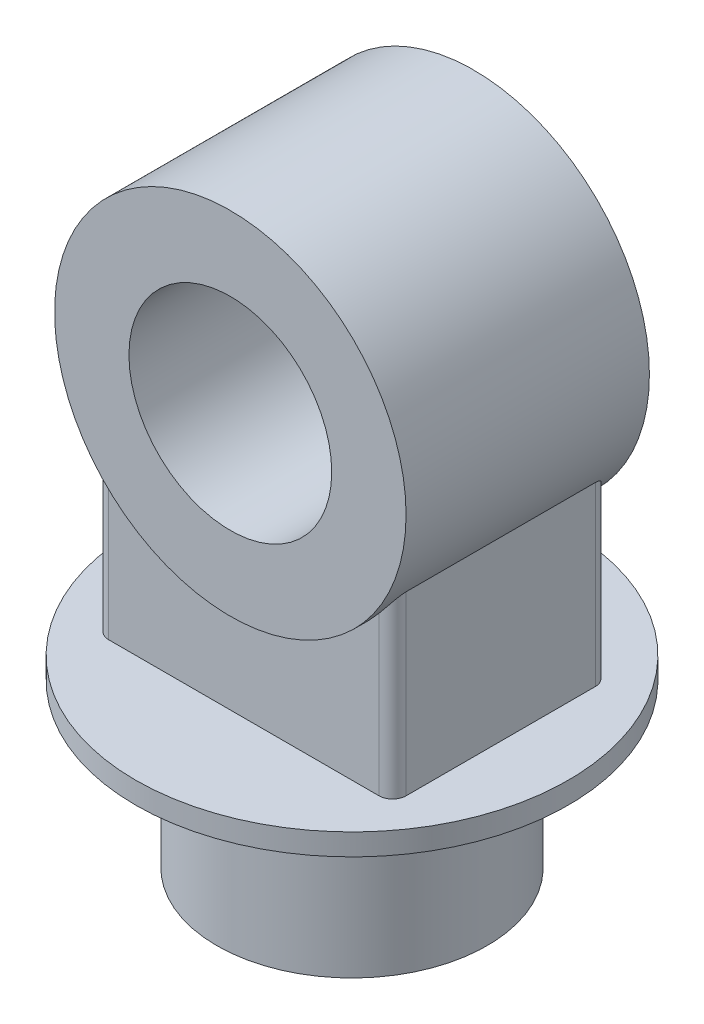
ISO-10303-21;
HEADER;
FILE_DESCRIPTION(('STEP AP214'),'2;1');
FILE_NAME('part.step','',(''),(''),'','','');
FILE_SCHEMA(('AUTOMOTIVE_DESIGN { 1 0 10303 214 1 1 1 1 }'));
ENDSEC;
DATA;
#1=APPLICATION_CONTEXT('core data for automotive mechanical design processes');
#2=APPLICATION_PROTOCOL_DEFINITION('international standard','automotive_design',2000,#1);
#3=PRODUCT_CONTEXT('',#1,'mechanical');
#4=PRODUCT('Part','Part','',(#3));
#5=PRODUCT_RELATED_PRODUCT_CATEGORY('part','',(#4));
#6=PRODUCT_DEFINITION_FORMATION('','',#4);
#7=PRODUCT_DEFINITION_CONTEXT('part definition',#1,'design');
#8=PRODUCT_DEFINITION('design','',#6,#7);
#9=PRODUCT_DEFINITION_SHAPE('','',#8);
#10=(LENGTH_UNIT() NAMED_UNIT(*) SI_UNIT(.MILLI.,.METRE.));
#11=(NAMED_UNIT(*) PLANE_ANGLE_UNIT() SI_UNIT($,.RADIAN.));
#12=(NAMED_UNIT(*) SI_UNIT($,.STERADIAN.) SOLID_ANGLE_UNIT());
#13=UNCERTAINTY_MEASURE_WITH_UNIT(LENGTH_MEASURE(1.E-05),#10,'distance_accuracy_value','');
#14=(GEOMETRIC_REPRESENTATION_CONTEXT(3) GLOBAL_UNCERTAINTY_ASSIGNED_CONTEXT((#13)) GLOBAL_UNIT_ASSIGNED_CONTEXT((#10,
#11,#12)) REPRESENTATION_CONTEXT('',''));
#15=CARTESIAN_POINT('',(0.,0.,0.));
#16=DIRECTION('',(0.,0.,1.));
#17=DIRECTION('',(1.,0.,0.));
#18=AXIS2_PLACEMENT_3D('',#15,#16,#17);
#19=CARTESIAN_POINT('',(0.,3048.,0.));
#20=DIRECTION('',(0.,-1.,0.));
#21=DIRECTION('',(0.,0.,-1.));
#22=AXIS2_PLACEMENT_3D('',#19,#20,#21);
#23=CYLINDRICAL_SURFACE('',#22,2540.);
#24=CARTESIAN_POINT('',(0.,3048.,0.));
#25=DIRECTION('',(0.,1.,0.));
#26=DIRECTION('',(0.,0.,1.));
#27=AXIS2_PLACEMENT_3D('',#24,#25,#26);
#28=CIRCLE('',#27,2540.);
#29=CARTESIAN_POINT('',(0.,3048.,2540.));
#30=VERTEX_POINT('',#29);
#31=EDGE_CURVE('E149',#30,#30,#28,.T.);
#32=ORIENTED_EDGE('',*,*,#31,.F.);
#33=EDGE_LOOP('',(#32));
#34=FACE_BOUND('',#33,.T.);
#35=CARTESIAN_POINT('',(0.,0.,0.));
#36=DIRECTION('',(0.,1.,0.));
#37=DIRECTION('',(0.,0.,1.));
#38=AXIS2_PLACEMENT_3D('',#35,#36,#37);
#39=CIRCLE('',#38,2540.);
#40=CARTESIAN_POINT('',(0.,0.,2540.));
#41=VERTEX_POINT('',#40);
#42=EDGE_CURVE('E233',#41,#41,#39,.T.);
#43=ORIENTED_EDGE('',*,*,#42,.T.);
#44=EDGE_LOOP('',(#43));
#45=FACE_BOUND('',#44,.T.);
#46=ADVANCED_FACE('F42',(#34,#45),#23,.T.);
#47=CARTESIAN_POINT('',(0.,0.,0.));
#48=DIRECTION('',(0.,1.,0.));
#49=DIRECTION('',(0.,0.,1.));
#50=AXIS2_PLACEMENT_3D('',#47,#48,#49);
#51=PLANE('',#50);
#52=ORIENTED_EDGE('',*,*,#42,.F.);
#53=EDGE_LOOP('',(#52));
#54=FACE_BOUND('',#53,.T.);
#55=ADVANCED_FACE('F245',(#54),#51,.F.);
#56=CARTESIAN_POINT('',(0.,3454.4,0.));
#57=DIRECTION('',(0.,-1.,0.));
#58=DIRECTION('',(0.,0.,-1.));
#59=AXIS2_PLACEMENT_3D('',#56,#57,#58);
#60=CYLINDRICAL_SURFACE('',#59,4064.);
#61=CARTESIAN_POINT('',(0.,3454.4,0.));
#62=DIRECTION('',(0.,1.,0.));
#63=DIRECTION('',(0.,0.,1.));
#64=AXIS2_PLACEMENT_3D('',#61,#62,#63);
#65=CIRCLE('',#64,4064.);
#66=CARTESIAN_POINT('',(0.,3454.4,4064.));
#67=VERTEX_POINT('',#66);
#68=EDGE_CURVE('E229',#67,#67,#65,.T.);
#69=ORIENTED_EDGE('',*,*,#68,.F.);
#70=EDGE_LOOP('',(#69));
#71=FACE_BOUND('',#70,.T.);
#72=CARTESIAN_POINT('',(0.,3048.,0.));
#73=DIRECTION('',(0.,1.,0.));
#74=DIRECTION('',(0.,0.,1.));
#75=AXIS2_PLACEMENT_3D('',#72,#73,#74);
#76=CIRCLE('',#75,4064.);
#77=CARTESIAN_POINT('',(0.,3048.,4064.));
#78=VERTEX_POINT('',#77);
#79=EDGE_CURVE('E234',#78,#78,#76,.T.);
#80=ORIENTED_EDGE('',*,*,#79,.T.);
#81=EDGE_LOOP('',(#80));
#82=FACE_BOUND('',#81,.T.);
#83=ADVANCED_FACE('F247',(#71,#82),#60,.T.);
#84=CARTESIAN_POINT('',(0.,3454.4,0.));
#85=DIRECTION('',(0.,1.,0.));
#86=DIRECTION('',(0.,0.,1.));
#87=AXIS2_PLACEMENT_3D('',#84,#85,#86);
#88=PLANE('',#87);
#89=DIRECTION('',(0.,0.,1.));
#90=VECTOR('',#89,1.);
#91=CARTESIAN_POINT('',(-2794.,3454.4,-2032.));
#92=LINE('',#91,#90);
#93=CARTESIAN_POINT('',(-2794.,3454.4,-1778.));
#94=VERTEX_POINT('',#93);
#95=CARTESIAN_POINT('',(-2794.,3454.4,1778.));
#96=VERTEX_POINT('',#95);
#97=EDGE_CURVE('E209',#94,#96,#92,.T.);
#98=ORIENTED_EDGE('',*,*,#97,.F.);
#99=CARTESIAN_POINT('',(-2540.,3454.4,-1778.));
#100=DIRECTION('',(0.,1.,0.));
#101=DIRECTION('',(0.,0.,1.));
#102=AXIS2_PLACEMENT_3D('',#99,#100,#101);
#103=CIRCLE('',#102,254.);
#104=CARTESIAN_POINT('',(-2540.,3454.4,-2032.));
#105=VERTEX_POINT('',#104);
#106=EDGE_CURVE('E127',#94,#105,#103,.F.);
#107=ORIENTED_EDGE('',*,*,#106,.T.);
#108=DIRECTION('',(-1.,0.,0.));
#109=VECTOR('',#108,1.);
#110=CARTESIAN_POINT('',(2794.,3454.4,-2032.));
#111=LINE('',#110,#109);
#112=CARTESIAN_POINT('',(2540.,3454.4,-2032.));
#113=VERTEX_POINT('',#112);
#114=EDGE_CURVE('E138',#113,#105,#111,.T.);
#115=ORIENTED_EDGE('',*,*,#114,.F.);
#116=CARTESIAN_POINT('',(2540.,3454.4,-1778.));
#117=DIRECTION('',(0.,1.,0.));
#118=DIRECTION('',(0.,0.,1.));
#119=AXIS2_PLACEMENT_3D('',#116,#117,#118);
#120=CIRCLE('',#119,254.);
#121=CARTESIAN_POINT('',(2794.,3454.4,-1778.));
#122=VERTEX_POINT('',#121);
#123=EDGE_CURVE('E126',#113,#122,#120,.F.);
#124=ORIENTED_EDGE('',*,*,#123,.T.);
#125=DIRECTION('',(0.,0.,-1.));
#126=VECTOR('',#125,1.);
#127=CARTESIAN_POINT('',(2794.,3454.4,-2032.));
#128=LINE('',#127,#126);
#129=CARTESIAN_POINT('',(2794.,3454.4,1778.));
#130=VERTEX_POINT('',#129);
#131=EDGE_CURVE('E281',#130,#122,#128,.T.);
#132=ORIENTED_EDGE('',*,*,#131,.F.);
#133=CARTESIAN_POINT('',(2540.,3454.4,1778.));
#134=DIRECTION('',(0.,1.,0.));
#135=DIRECTION('',(0.,0.,1.));
#136=AXIS2_PLACEMENT_3D('',#133,#134,#135);
#137=CIRCLE('',#136,254.);
#138=CARTESIAN_POINT('',(2540.,3454.4,2032.));
#139=VERTEX_POINT('',#138);
#140=EDGE_CURVE('E64',#130,#139,#137,.F.);
#141=ORIENTED_EDGE('',*,*,#140,.T.);
#142=DIRECTION('',(1.,0.,0.));
#143=VECTOR('',#142,1.);
#144=CARTESIAN_POINT('',(2794.,3454.4,2032.));
#145=LINE('',#144,#143);
#146=CARTESIAN_POINT('',(-2540.,3454.4,2032.));
#147=VERTEX_POINT('',#146);
#148=EDGE_CURVE('E210',#147,#139,#145,.T.);
#149=ORIENTED_EDGE('',*,*,#148,.F.);
#150=CARTESIAN_POINT('',(-2540.,3454.4,1778.));
#151=DIRECTION('',(0.,1.,0.));
#152=DIRECTION('',(0.,0.,1.));
#153=AXIS2_PLACEMENT_3D('',#150,#151,#152);
#154=CIRCLE('',#153,254.);
#155=EDGE_CURVE('E57',#147,#96,#154,.F.);
#156=ORIENTED_EDGE('',*,*,#155,.T.);
#157=EDGE_LOOP('',(#98,#107,#115,#124,#132,#141,#149,#156));
#158=FACE_BOUND('',#157,.T.);
#159=ORIENTED_EDGE('',*,*,#68,.T.);
#160=EDGE_LOOP('',(#159));
#161=FACE_BOUND('',#160,.T.);
#162=ADVANCED_FACE('F207',(#158,#161),#88,.T.);
#163=CARTESIAN_POINT('',(0.,3048.,0.));
#164=DIRECTION('',(0.,1.,0.));
#165=DIRECTION('',(0.,0.,1.));
#166=AXIS2_PLACEMENT_3D('',#163,#164,#165);
#167=PLANE('',#166);
#168=ORIENTED_EDGE('',*,*,#31,.T.);
#169=EDGE_LOOP('',(#168));
#170=FACE_BOUND('',#169,.T.);
#171=ORIENTED_EDGE('',*,*,#79,.F.);
#172=EDGE_LOOP('',(#171));
#173=FACE_BOUND('',#172,.T.);
#174=ADVANCED_FACE('F256',(#170,#173),#167,.F.);
#175=CARTESIAN_POINT('',(2794.,11836.402,2032.));
#176=DIRECTION('',(0.,0.,-1.));
#177=DIRECTION('',(-1.,0.,0.));
#178=AXIS2_PLACEMENT_3D('',#175,#176,#177);
#179=PLANE('',#178);
#180=ORIENTED_EDGE('',*,*,#148,.T.);
#181=DIRECTION('',(0.,-1.,0.));
#182=VECTOR('',#181,1.);
#183=CARTESIAN_POINT('',(2540.,11836.402,2032.));
#184=LINE('',#183,#182);
#185=CARTESIAN_POINT('',(2540.,6424.51753881881,2032.));
#186=VERTEX_POINT('',#185);
#187=EDGE_CURVE('E165',#139,#186,#184,.F.);
#188=ORIENTED_EDGE('',*,*,#187,.T.);
#189=CARTESIAN_POINT('',(0.,8534.4,2032.));
#190=DIRECTION('',(0.,0.,-1.));
#191=DIRECTION('',(-1.,0.,0.));
#192=AXIS2_PLACEMENT_3D('',#189,#190,#191);
#193=CIRCLE('',#192,3302.);
#194=CARTESIAN_POINT('',(-2540.,6424.51753881881,2032.));
#195=VERTEX_POINT('',#194);
#196=EDGE_CURVE('E137',#195,#186,#193,.F.);
#197=ORIENTED_EDGE('',*,*,#196,.F.);
#198=DIRECTION('',(0.,-1.,0.));
#199=VECTOR('',#198,1.);
#200=CARTESIAN_POINT('',(-2540.,11836.402,2032.));
#201=LINE('',#200,#199);
#202=EDGE_CURVE('E162',#195,#147,#201,.T.);
#203=ORIENTED_EDGE('',*,*,#202,.T.);
#204=EDGE_LOOP('',(#180,#188,#197,#203));
#205=FACE_BOUND('',#204,.T.);
#206=ADVANCED_FACE('F218',(#205),#179,.F.);
#207=CARTESIAN_POINT('',(-2794.,11836.402,-2032.));
#208=DIRECTION('',(1.,0.,0.));
#209=DIRECTION('',(0.,0.,-1.));
#210=AXIS2_PLACEMENT_3D('',#207,#208,#209);
#211=PLANE('',#210);
#212=DIRECTION('',(0.,0.,-1.));
#213=VECTOR('',#212,1.);
#214=CARTESIAN_POINT('',(-2794.,6774.63637951002,2286.));
#215=LINE('',#214,#213);
#216=CARTESIAN_POINT('',(-2794.,6774.63637951002,-1778.));
#217=VERTEX_POINT('',#216);
#218=CARTESIAN_POINT('',(-2794.,6774.63637951002,1778.));
#219=VERTEX_POINT('',#218);
#220=EDGE_CURVE('E118',#217,#219,#215,.F.);
#221=ORIENTED_EDGE('',*,*,#220,.F.);
#222=DIRECTION('',(0.,-1.,0.));
#223=VECTOR('',#222,1.);
#224=CARTESIAN_POINT('',(-2794.,11836.402,-1778.));
#225=LINE('',#224,#223);
#226=EDGE_CURVE('E133',#217,#94,#225,.T.);
#227=ORIENTED_EDGE('',*,*,#226,.T.);
#228=ORIENTED_EDGE('',*,*,#97,.T.);
#229=DIRECTION('',(0.,-1.,0.));
#230=VECTOR('',#229,1.);
#231=CARTESIAN_POINT('',(-2794.,11836.402,1778.));
#232=LINE('',#231,#230);
#233=EDGE_CURVE('E135',#96,#219,#232,.F.);
#234=ORIENTED_EDGE('',*,*,#233,.T.);
#235=EDGE_LOOP('',(#221,#227,#228,#234));
#236=FACE_BOUND('',#235,.T.);
#237=ADVANCED_FACE('F131',(#236),#211,.F.);
#238=CARTESIAN_POINT('',(2794.,11836.402,-2032.));
#239=DIRECTION('',(-1.,0.,0.));
#240=DIRECTION('',(0.,0.,1.));
#241=AXIS2_PLACEMENT_3D('',#238,#239,#240);
#242=PLANE('',#241);
#243=ORIENTED_EDGE('',*,*,#131,.T.);
#244=DIRECTION('',(0.,-1.,0.));
#245=VECTOR('',#244,1.);
#246=CARTESIAN_POINT('',(2794.,11836.402,-1778.));
#247=LINE('',#246,#245);
#248=CARTESIAN_POINT('',(2794.,6774.63637951002,-1778.));
#249=VERTEX_POINT('',#248);
#250=EDGE_CURVE('E159',#122,#249,#247,.F.);
#251=ORIENTED_EDGE('',*,*,#250,.T.);
#252=DIRECTION('',(0.,0.,-1.));
#253=VECTOR('',#252,1.);
#254=CARTESIAN_POINT('',(2794.,6774.63637951002,2286.));
#255=LINE('',#254,#253);
#256=CARTESIAN_POINT('',(2794.,6774.63637951002,1778.));
#257=VERTEX_POINT('',#256);
#258=EDGE_CURVE('E221',#257,#249,#255,.T.);
#259=ORIENTED_EDGE('',*,*,#258,.F.);
#260=DIRECTION('',(0.,-1.,0.));
#261=VECTOR('',#260,1.);
#262=CARTESIAN_POINT('',(2794.,11836.402,1778.));
#263=LINE('',#262,#261);
#264=EDGE_CURVE('E155',#257,#130,#263,.T.);
#265=ORIENTED_EDGE('',*,*,#264,.T.);
#266=EDGE_LOOP('',(#243,#251,#259,#265));
#267=FACE_BOUND('',#266,.T.);
#268=ADVANCED_FACE('F264',(#267),#242,.F.);
#269=CARTESIAN_POINT('',(2794.,11836.402,-2032.));
#270=DIRECTION('',(0.,0.,1.));
#271=DIRECTION('',(1.,0.,0.));
#272=AXIS2_PLACEMENT_3D('',#269,#270,#271);
#273=PLANE('',#272);
#274=ORIENTED_EDGE('',*,*,#114,.T.);
#275=DIRECTION('',(0.,-1.,0.));
#276=VECTOR('',#275,1.);
#277=CARTESIAN_POINT('',(-2540.,11836.402,-2032.));
#278=LINE('',#277,#276);
#279=CARTESIAN_POINT('',(-2540.,6424.51753881881,-2032.));
#280=VERTEX_POINT('',#279);
#281=EDGE_CURVE('E147',#105,#280,#278,.F.);
#282=ORIENTED_EDGE('',*,*,#281,.T.);
#283=CARTESIAN_POINT('',(0.,8534.4,-2032.));
#284=DIRECTION('',(0.,0.,1.));
#285=DIRECTION('',(1.,0.,0.));
#286=AXIS2_PLACEMENT_3D('',#283,#284,#285);
#287=CIRCLE('',#286,3302.);
#288=CARTESIAN_POINT('',(2540.,6424.51753881881,-2032.));
#289=VERTEX_POINT('',#288);
#290=EDGE_CURVE('E121',#289,#280,#287,.F.);
#291=ORIENTED_EDGE('',*,*,#290,.F.);
#292=DIRECTION('',(0.,-1.,0.));
#293=VECTOR('',#292,1.);
#294=CARTESIAN_POINT('',(2540.,11836.402,-2032.));
#295=LINE('',#294,#293);
#296=EDGE_CURVE('E142',#289,#113,#295,.T.);
#297=ORIENTED_EDGE('',*,*,#296,.T.);
#298=EDGE_LOOP('',(#274,#282,#291,#297));
#299=FACE_BOUND('',#298,.T.);
#300=ADVANCED_FACE('F268',(#299),#273,.F.);
#301=CARTESIAN_POINT('',(0.,8534.4,2286.));
#302=DIRECTION('',(0.,0.,-1.));
#303=DIRECTION('',(-1.,0.,0.));
#304=AXIS2_PLACEMENT_3D('',#301,#302,#303);
#305=CYLINDRICAL_SURFACE('',#304,3302.);
#306=CARTESIAN_POINT('',(0.,8534.4,2286.));
#307=DIRECTION('',(0.,0.,1.));
#308=DIRECTION('',(1.,0.,0.));
#309=AXIS2_PLACEMENT_3D('',#306,#307,#308);
#310=CIRCLE('',#309,3302.);
#311=CARTESIAN_POINT('',(3302.,8534.4,2286.));
#312=VERTEX_POINT('',#311);
#313=EDGE_CURVE('E212',#312,#312,#310,.T.);
#314=ORIENTED_EDGE('',*,*,#313,.F.);
#315=EDGE_LOOP('',(#314));
#316=FACE_BOUND('',#315,.T.);
#317=CARTESIAN_POINT('',(0.,8534.4,-2286.));
#318=DIRECTION('',(0.,0.,1.));
#319=DIRECTION('',(1.,0.,0.));
#320=AXIS2_PLACEMENT_3D('',#317,#318,#319);
#321=CIRCLE('',#320,3302.);
#322=CARTESIAN_POINT('',(3302.,8534.4,-2286.));
#323=VERTEX_POINT('',#322);
#324=EDGE_CURVE('E286',#323,#323,#321,.T.);
#325=ORIENTED_EDGE('',*,*,#324,.T.);
#326=EDGE_LOOP('',(#325));
#327=FACE_BOUND('',#326,.T.);
#328=ORIENTED_EDGE('',*,*,#290,.T.);
#329=CARTESIAN_POINT('',(-2540.,6424.51753881881,-2032.));
#330=CARTESIAN_POINT('',(-2542.83977860557,6427.93622161435,-2031.9999734893));
#331=CARTESIAN_POINT('',(-2545.67262886829,6431.36062344505,-2031.95237538715));
#332=CARTESIAN_POINT('',(-2551.32318321051,6438.2192475725,-2031.76323632053));
#333=CARTESIAN_POINT('',(-2554.14088748035,6441.65346974501,-2031.62169653936));
#334=CARTESIAN_POINT('',(-2559.75979933091,6448.53004086149,-2031.2458832437));
#335=CARTESIAN_POINT('',(-2562.56100768401,6451.97238941422,-2031.01161410658));
#336=CARTESIAN_POINT('',(-2568.14589800616,6458.86384836957,-2030.45135161428));
#337=CARTESIAN_POINT('',(-2570.92957990912,6462.31295879762,-2030.12535791346));
#338=CARTESIAN_POINT('',(-2576.48087919177,6469.21963800538,-2029.38216934964));
#339=CARTESIAN_POINT('',(-2579.24847905792,6472.67721168396,-2028.96488924465));
#340=CARTESIAN_POINT('',(-2584.76388850416,6479.59606452742,-2028.04002300334));
#341=CARTESIAN_POINT('',(-2587.51169806634,6483.05734369566,-2027.53243678526));
#342=CARTESIAN_POINT('',(-2592.98649763878,6489.98211102143,-2026.42751407468));
#343=CARTESIAN_POINT('',(-2595.71348738783,6493.44559920609,-2025.8301764581));
#344=CARTESIAN_POINT('',(-2601.14557385789,6500.37318641411,-2024.5461577295));
#345=CARTESIAN_POINT('',(-2603.85067055837,6503.83728543803,-2023.85947653378));
#346=CARTESIAN_POINT('',(-2609.26591476256,6510.80047435419,-2022.38941490154));
#347=CARTESIAN_POINT('',(-2611.97582296525,6514.29955401973,-2021.60510427863));
#348=CARTESIAN_POINT('',(-2617.37117316369,6521.29502174544,-2019.94558797426));
#349=CARTESIAN_POINT('',(-2620.05661516282,6524.79140980597,-2019.07038230541));
#350=CARTESIAN_POINT('',(-2625.40202527443,6531.77982659366,-2017.22893926882));
#351=CARTESIAN_POINT('',(-2628.06199278137,6535.27185521549,-2016.2626997431));
#352=CARTESIAN_POINT('',(-2633.35530016709,6542.24964417058,-2014.23889753478));
#353=CARTESIAN_POINT('',(-2635.98863999184,6545.73540449111,-2013.18133466691));
#354=CARTESIAN_POINT('',(-2641.22624406055,6552.69697178173,-2010.97493145605));
#355=CARTESIAN_POINT('',(-2643.83052222256,6556.17278286649,-2009.82613715092));
#356=CARTESIAN_POINT('',(-2649.01014681255,6563.11412661108,-2007.43609803065));
#357=CARTESIAN_POINT('',(-2651.58549346622,6566.57965935092,-2006.19485393725));
#358=CARTESIAN_POINT('',(-2656.70581227357,6573.49797664728,-2003.61907238506));
#359=CARTESIAN_POINT('',(-2659.25078710741,6576.95076230981,-2002.28454323056));
#360=CARTESIAN_POINT('',(-2664.30926376633,6583.84151191211,-1999.52090942607));
#361=CARTESIAN_POINT('',(-2666.82276550256,6587.27947581002,-1998.09180450918));
#362=CARTESIAN_POINT('',(-2672.42939284743,6594.97919920992,-1994.7752522514));
#363=CARTESIAN_POINT('',(-2675.51347601726,6599.23619069841,-1992.86135887939));
#364=CARTESIAN_POINT('',(-2681.62749276398,6607.71753574206,-1988.88138436238));
#365=CARTESIAN_POINT('',(-2684.65742844154,6611.94189055976,-1986.81530913733));
#366=CARTESIAN_POINT('',(-2690.66001770349,6620.35210095167,-1982.52668728021));
#367=CARTESIAN_POINT('',(-2693.63266895241,6624.5379549526,-1980.30413428573));
#368=CARTESIAN_POINT('',(-2699.51669088708,6632.86387869651,-1975.6977137502));
#369=CARTESIAN_POINT('',(-2702.42806123731,6637.00394818874,-1973.31384532623));
#370=CARTESIAN_POINT('',(-2708.17703457426,6645.21863977067,-1968.38587042588));
#371=CARTESIAN_POINT('',(-2711.01481966652,6649.29341146342,-1965.84222642692));
#372=CARTESIAN_POINT('',(-2716.61983468486,6657.37978858898,-1960.58205341184));
#373=CARTESIAN_POINT('',(-2719.38706292178,6661.39139250864,-1957.8655202621));
#374=CARTESIAN_POINT('',(-2724.84380189956,6669.33874584763,-1952.25293041896));
#375=CARTESIAN_POINT('',(-2727.53333823711,6673.27452010443,-1949.35693386455));
#376=CARTESIAN_POINT('',(-2732.82817451339,6681.05806853299,-1943.37607553343));
#377=CARTESIAN_POINT('',(-2735.43348225661,6684.90585084821,-1940.29123133213));
#378=CARTESIAN_POINT('',(-2739.59611244767,6691.08087918665,-1935.11125140864));
#379=CARTESIAN_POINT('',(-2741.18172278654,6693.43974099827,-1933.07634598778));
#380=CARTESIAN_POINT('',(-2744.31380948043,6698.11199902808,-1928.92589797701));
#381=CARTESIAN_POINT('',(-2745.86028747485,6700.42539715001,-1926.81035877451));
#382=CARTESIAN_POINT('',(-2748.9113713213,6705.00178293512,-1922.49574593458));
#383=CARTESIAN_POINT('',(-2750.41597436698,6707.26476721766,-1920.29666672176));
#384=CARTESIAN_POINT('',(-2753.37994525516,6711.73435120665,-1915.81227371327));
#385=CARTESIAN_POINT('',(-2754.83931292045,6713.9409506922,-1913.52695957984));
#386=CARTESIAN_POINT('',(-2757.70866421257,6718.29050192588,-1908.86794930323));
#387=CARTESIAN_POINT('',(-2759.11866259583,6720.43347266295,-1906.49428001457));
#388=CARTESIAN_POINT('',(-2761.8855537627,6724.64903794148,-1901.65504311363));
#389=CARTESIAN_POINT('',(-2763.24244554673,6726.72163115819,-1899.18947377327));
#390=CARTESIAN_POINT('',(-2765.89799144176,6730.78746003102,-1894.16441362361));
#391=CARTESIAN_POINT('',(-2767.19666069295,6732.78071630262,-1891.60494754971));
#392=CARTESIAN_POINT('',(-2769.73059696136,6736.67871305885,-1886.38937943326));
#393=CARTESIAN_POINT('',(-2770.96586878652,6738.58346025479,-1883.73328474504));
#394=CARTESIAN_POINT('',(-2773.87166230378,6743.07371981701,-1877.1852796379));
#395=CARTESIAN_POINT('',(-2775.50702168491,6745.60905649436,-1873.24296962534));
#396=CARTESIAN_POINT('',(-2778.61817497287,6750.44559855716,-1865.15576363629));
#397=CARTESIAN_POINT('',(-2780.09397924302,6752.74681914817,-1861.01088084258));
#398=CARTESIAN_POINT('',(-2782.16790082376,6755.98851413022,-1854.65281448186));
#399=CARTESIAN_POINT('',(-2782.83479269946,6757.03229884736,-1852.5141337591));
#400=CARTESIAN_POINT('',(-2784.12022732024,6759.04651802023,-1848.18834886601));
#401=CARTESIAN_POINT('',(-2784.738775148,6760.01696018649,-1846.00124981728));
#402=CARTESIAN_POINT('',(-2785.92442375123,6761.87910476923,-1841.57999978288));
#403=CARTESIAN_POINT('',(-2786.49152353764,6762.77080567192,-1839.34584789365));
#404=CARTESIAN_POINT('',(-2787.57105773969,6764.46988520958,-1834.83268561231));
#405=CARTESIAN_POINT('',(-2788.08349366066,6765.27726616652,-1832.55367645752));
#406=CARTESIAN_POINT('',(-2789.00083023081,6766.7238347182,-1828.18997813993));
#407=CARTESIAN_POINT('',(-2789.41136999526,6767.37178014488,-1826.10937609511));
#408=CARTESIAN_POINT('',(-2790.18361669496,6768.59142989419,-1821.91697488124));
#409=CARTESIAN_POINT('',(-2790.5453245395,6769.16313563644,-1819.80517629389));
#410=CARTESIAN_POINT('',(-2791.21767452149,6770.22645718312,-1815.55408765039));
#411=CARTESIAN_POINT('',(-2791.52833122583,6770.71809583344,-1813.41480562482));
#412=CARTESIAN_POINT('',(-2792.09673285078,6771.61807423499,-1809.11184192219));
#413=CARTESIAN_POINT('',(-2792.35447894374,6772.02641583182,-1806.94816078685));
#414=CARTESIAN_POINT('',(-2792.81823440346,6772.76141589791,-1802.5731474505));
#415=CARTESIAN_POINT('',(-2793.02355301945,6773.08698357203,-1800.36155811253));
#416=CARTESIAN_POINT('',(-2793.37669027031,6773.64709970057,-1795.92235426052));
#417=CARTESIAN_POINT('',(-2793.52450975042,6773.88164949295,-1793.69473998253));
#418=CARTESIAN_POINT('',(-2793.7617057171,6774.2580791307,-1789.22543095468));
#419=CARTESIAN_POINT('',(-2793.8510029289,6774.399833274,-1786.98372124131));
#420=CARTESIAN_POINT('',(-2793.94036625205,6774.54170102292,-1783.61708634609));
#421=CARTESIAN_POINT('',(-2793.96272361549,6774.57719636991,-1782.49410431326));
#422=CARTESIAN_POINT('',(-2793.99254184018,6774.62453802274,-1780.24743081372));
#423=CARTESIAN_POINT('',(-2794.00000252148,6774.63638404291,-1779.12373933859));
#424=CARTESIAN_POINT('',(-2794.,6774.63637951002,-1778.));
#425=B_SPLINE_CURVE_WITH_KNOTS('',3,(#329,#330,#331,#332,#333,#334,#335,#336,#337,#338,#339,
#340,#341,#342,#343,#344,#345,#346,#347,#348,#349,#350,#351,#352,#353,#354,#355,#356,#357,#358,
#359,#360,#361,#362,#363,#364,#365,#366,#367,#368,#369,#370,#371,#372,#373,#374,#375,#376,#377,
#378,#379,#380,#381,#382,#383,#384,#385,#386,#387,#388,#389,#390,#391,#392,#393,#394,#395,#396,
#397,#398,#399,#400,#401,#402,#403,#404,#405,#406,#407,#408,#409,#410,#411,#412,#413,#414,#415,
#416,#417,#418,#419,#420,#421,#422,#423,#424),.UNSPECIFIED.,.F.,.F.,(4,2,2,2,2,2,2,2,2,2,2,2,2,
2,2,2,2,2,2,2,2,2,2,2,2,2,2,2,2,2,2,2,2,2,2,2,2,2,2,2,2,2,2,2,2,2,2,4),(0.,13.3325731309089,
26.6649783266545,39.9967542281352,53.328580368407,66.6729091320811,80.0172499763164,
93.3617579654759,106.706278456229,120.189385373508,133.672490420767,147.155915169039,
160.639367271433,174.116057973203,187.592643475093,201.068030805628,214.543456166552,
231.324022303993,248.103936015557,264.884532396287,281.665220628519,298.399394733672,
315.133969088228,331.86296562332,348.590407606825,359.075960416877,369.561073217003,
380.046887018741,390.532741893908,401.015435329469,411.498325979355,421.978474656348,
432.457827360742,447.339644037475,462.220493540057,469.633233914451,477.045193896404,
484.45729634197,491.869194622672,498.519717435844,505.17011639461,511.818614428611,
518.466965137211,525.198850780705,531.93063746234,538.671524335319,542.042519234386,
545.41355485247),.UNSPECIFIED.);
#426=EDGE_CURVE('E115',#280,#217,#425,.T.);
#427=ORIENTED_EDGE('',*,*,#426,.T.);
#428=ORIENTED_EDGE('',*,*,#220,.T.);
#429=CARTESIAN_POINT('',(-2794.,6774.63637951002,1778.));
#430=CARTESIAN_POINT('',(-2794.00000174196,6774.63638264187,1779.02497469673));
#431=CARTESIAN_POINT('',(-2793.99379531502,6774.62652820204,1780.04991307944));
#432=CARTESIAN_POINT('',(-2793.96898653863,6774.58713976709,1782.09925365362));
#433=CARTESIAN_POINT('',(-2793.95038428594,6774.55760592558,1783.12365584922));
#434=CARTESIAN_POINT('',(-2793.87602052908,6774.43954839144,1786.19512814832));
#435=CARTESIAN_POINT('',(-2793.80170201586,6774.32156867143,1788.24072314059));
#436=CARTESIAN_POINT('',(-2793.60415589371,6774.00803960556,1792.3213484798));
#437=CARTESIAN_POINT('',(-2793.4809793328,6773.81257122178,1794.35638761458));
#438=CARTESIAN_POINT('',(-2793.1864877954,6773.3453953325,1798.41422230554));
#439=CARTESIAN_POINT('',(-2793.01517225589,6773.07368693534,1800.43701771824));
#440=CARTESIAN_POINT('',(-2792.62751614018,6772.4591137757,1804.44520941196));
#441=CARTESIAN_POINT('',(-2792.41167301453,6772.11703527968,1806.43077473624));
#442=CARTESIAN_POINT('',(-2791.93509518367,6771.36210378945,1810.38318260995));
#443=CARTESIAN_POINT('',(-2791.67435540532,6770.94924279711,1812.350023017));
#444=CARTESIAN_POINT('',(-2791.10935827596,6770.05512731515,1816.26221601373));
#445=CARTESIAN_POINT('',(-2790.8050915588,6769.57385810557,1818.20756388133));
#446=CARTESIAN_POINT('',(-2790.15464273529,6768.54569130306,1822.0737781585));
#447=CARTESIAN_POINT('',(-2789.80845896916,6767.99879111139,1823.99464359532));
#448=CARTESIAN_POINT('',(-2788.98756133025,6766.70288100536,1828.26931069734));
#449=CARTESIAN_POINT('',(-2788.50197668463,6765.93692440399,1830.61590628665));
#450=CARTESIAN_POINT('',(-2787.47213896295,6764.31412699742,1835.26437678415));
#451=CARTESIAN_POINT('',(-2786.92788265238,6763.4572811816,1837.56624921853));
#452=CARTESIAN_POINT('',(-2785.78403886702,6761.65850041581,1842.12272519984));
#453=CARTESIAN_POINT('',(-2785.18444647286,6760.71655790092,1844.3773245223));
#454=CARTESIAN_POINT('',(-2783.93331193687,6758.75344997865,1848.83717328533));
#455=CARTESIAN_POINT('',(-2783.2817639944,6757.73227572571,1851.04241718028));
#456=CARTESIAN_POINT('',(-2781.24880267458,6754.55016280933,1857.5990409809));
#457=CARTESIAN_POINT('',(-2779.79346674321,6752.27755379692,1861.87397358444));
#458=CARTESIAN_POINT('',(-2776.71164258883,6747.47958151699,1870.21373405539));
#459=CARTESIAN_POINT('',(-2775.08514410281,6744.95420309372,1874.27854930221));
#460=CARTESIAN_POINT('',(-2772.07222516912,6740.29146751183,1881.29341047258));
#461=CARTESIAN_POINT('',(-2770.71606582389,6738.19760124299,1884.28565876981));
#462=CARTESIAN_POINT('',(-2767.92330444798,6733.8969721097,1890.14952163145));
#463=CARTESIAN_POINT('',(-2766.48669269039,6731.6901955969,1893.02112153537));
#464=CARTESIAN_POINT('',(-2763.54020191773,6727.17648854903,1898.647701459));
#465=CARTESIAN_POINT('',(-2762.03029069471,6724.8695140345,1901.40262919879));
#466=CARTESIAN_POINT('',(-2758.94448224591,6720.16813772115,1906.79818291332));
#467=CARTESIAN_POINT('',(-2757.36858703324,6717.77373858987,1909.43881237023));
#468=CARTESIAN_POINT('',(-2754.15426526213,6712.90423917882,1914.61347351019));
#469=CARTESIAN_POINT('',(-2752.51575266154,6710.42902859016,1917.14734766375));
#470=CARTESIAN_POINT('',(-2749.1833665016,6705.41014460104,1922.10846056806));
#471=CARTESIAN_POINT('',(-2747.48949315198,6702.86647145994,1924.53569972269));
#472=CARTESIAN_POINT('',(-2744.05100156406,6697.71884086233,1929.28710197205));
#473=CARTESIAN_POINT('',(-2742.30639038596,6695.11489180344,1931.61127929533));
#474=CARTESIAN_POINT('',(-2738.769899571,6689.8530404074,1936.16076825609));
#475=CARTESIAN_POINT('',(-2736.97801727887,6687.19513504139,1938.38607432095));
#476=CARTESIAN_POINT('',(-2733.61263609546,6682.21922383177,1942.42634774005));
#477=CARTESIAN_POINT('',(-2732.04501310431,6679.90762504794,1944.25413060125));
#478=CARTESIAN_POINT('',(-2728.87955782605,6675.25280835313,1947.84179508296));
#479=CARTESIAN_POINT('',(-2727.28172650891,6672.90959145808,1949.60167887818));
#480=CARTESIAN_POINT('',(-2724.05722829755,6668.19412265563,1953.05576103033));
#481=CARTESIAN_POINT('',(-2722.43055729003,6665.82186662168,1954.74994990584));
#482=CARTESIAN_POINT('',(-2719.1500634985,6661.05131054242,1958.0741729757));
#483=CARTESIAN_POINT('',(-2717.49624048546,6658.6530102775,1959.70420662853));
#484=CARTESIAN_POINT('',(-2714.16186413331,6653.83147654578,1962.90263653937));
#485=CARTESIAN_POINT('',(-2712.48129652358,6651.40823002927,1964.47099822743));
#486=CARTESIAN_POINT('',(-2709.09553255246,6646.54031619722,1967.54664742016));
#487=CARTESIAN_POINT('',(-2707.39033625005,6644.09564893299,1969.05393507109));
#488=CARTESIAN_POINT('',(-2703.95649437307,6639.18701803243,1972.00875831289));
#489=CARTESIAN_POINT('',(-2702.22785016726,6636.72305552597,1973.45629737179));
#490=CARTESIAN_POINT('',(-2698.74799473771,6631.77749275273,1976.2929972149));
#491=CARTESIAN_POINT('',(-2696.99678299418,6629.29589208028,1977.6821566513));
#492=CARTESIAN_POINT('',(-2691.70215025175,6621.81512290854,1981.770414619));
#493=CARTESIAN_POINT('',(-2688.12594121955,6616.7917264225,1984.38324681021));
#494=CARTESIAN_POINT('',(-2680.89314443601,6606.69293438015,1989.38698684325));
#495=CARTESIAN_POINT('',(-2677.23655621501,6601.61753852012,1991.77789338794));
#496=CARTESIAN_POINT('',(-2669.84918636412,6591.4257532344,1996.34385578948));
#497=CARTESIAN_POINT('',(-2666.11842077062,6586.30937280895,1998.51895770487));
#498=CARTESIAN_POINT('',(-2658.58678822939,6576.04333620551,2002.65894009359));
#499=CARTESIAN_POINT('',(-2654.78592053195,6570.89367967201,2004.62381831713));
#500=CARTESIAN_POINT('',(-2646.58812802052,6559.85477332083,2008.6046567198));
#501=CARTESIAN_POINT('',(-2642.18146656641,6553.96173358412,2010.59010030168));
#502=CARTESIAN_POINT('',(-2633.28867851362,6542.1526825357,2014.2973300933));
#503=CARTESIAN_POINT('',(-2628.80255037975,6536.23667078192,2016.01911120325));
#504=CARTESIAN_POINT('',(-2619.75573130556,6524.39018378718,2019.20119896269));
#505=CARTESIAN_POINT('',(-2615.19503127795,6518.45970685955,2020.66147348204));
#506=CARTESIAN_POINT('',(-2606.00482472903,6506.59350783939,2023.32069900341));
#507=CARTESIAN_POINT('',(-2601.37531840472,6500.65778576193,2024.51965075352));
#508=CARTESIAN_POINT('',(-2592.09799330875,6488.84681357841,2026.64477616783));
#509=CARTESIAN_POINT('',(-2587.45078945451,6482.97153624512,2027.57348688204));
#510=CARTESIAN_POINT('',(-2578.09904246893,6471.23116463606,2029.17118483997));
#511=CARTESIAN_POINT('',(-2573.39450013142,6465.36607022058,2029.84017567529));
#512=CARTESIAN_POINT('',(-2566.29956178754,6456.58270137503,2030.64598852297));
#513=CARTESIAN_POINT('',(-2563.92846688015,6453.65758194597,2030.88163357237));
#514=CARTESIAN_POINT('',(-2559.17399740084,6447.81268062286,2031.28649815157));
#515=CARTESIAN_POINT('',(-2556.7906228582,6444.8928987161,2031.45571783975));
#516=CARTESIAN_POINT('',(-2552.01225802699,6439.05953843777,2031.72708357714));
#517=CARTESIAN_POINT('',(-2549.61726727032,6436.14596032312,2031.82922690043));
#518=CARTESIAN_POINT('',(-2544.81651489251,6430.32606114424,2031.96567848209));
#519=CARTESIAN_POINT('',(-2542.41075318327,6427.41974013967,2031.99998618455));
#520=CARTESIAN_POINT('',(-2540.,6424.51753881881,2032.));
#521=B_SPLINE_CURVE_WITH_KNOTS('',3,(#429,#430,#431,#432,#433,#434,#435,#436,#437,#438,#439,
#440,#441,#442,#443,#444,#445,#446,#447,#448,#449,#450,#451,#452,#453,#454,#455,#456,#457,#458,
#459,#460,#461,#462,#463,#464,#465,#466,#467,#468,#469,#470,#471,#472,#473,#474,#475,#476,#477,
#478,#479,#480,#481,#482,#483,#484,#485,#486,#487,#488,#489,#490,#491,#492,#493,#494,#495,#496,
#497,#498,#499,#500,#501,#502,#503,#504,#505,#506,#507,#508,#509,#510,#511,#512,#513,#514,#515,
#516,#517,#518,#519,#520),.UNSPECIFIED.,.F.,.F.,(4,2,2,2,2,2,2,2,2,2,2,2,2,2,2,2,2,2,2,2,2,2,2,
2,2,2,2,2,2,2,2,2,2,2,2,2,2,2,2,2,2,2,2,2,2,4),(0.,3.07478563664829,6.14954727233706,
12.2982937397526,18.4406327054803,24.5830435118247,30.6602265948873,36.738096827451,
42.8172768713665,48.8966977085488,56.4409866155735,63.9856916462394,71.5310680453812,
79.0772880374413,94.227089045328,109.377798962321,121.06068448359,132.744985558408,
144.434468050095,156.123594163572,167.829404477559,179.535170451804,191.239315282869,
202.944118954383,212.956900554085,222.969361192932,232.983261543179,242.997246399629,
253.016766776402,263.036263156721,273.055177148301,283.074322319114,303.160473090191,
323.246741255267,343.328713203348,363.410900044784,386.270421599316,409.130385250049,
431.993155677034,454.855860653754,477.496438924224,500.136704093643,511.454576500168,
522.772421919116,534.090727254507,545.409125343038),.UNSPECIFIED.);
#522=EDGE_CURVE('E11',#219,#195,#521,.T.);
#523=ORIENTED_EDGE('',*,*,#522,.T.);
#524=ORIENTED_EDGE('',*,*,#196,.T.);
#525=CARTESIAN_POINT('',(2540.,6424.51753881881,2032.));
#526=CARTESIAN_POINT('',(2542.83977860557,6427.93622161435,2031.9999734893));
#527=CARTESIAN_POINT('',(2545.67262886829,6431.36062344504,2031.95237538715));
#528=CARTESIAN_POINT('',(2551.32318321051,6438.2192475725,2031.76323632053));
#529=CARTESIAN_POINT('',(2554.14088748035,6441.65346974501,2031.62169653936));
#530=CARTESIAN_POINT('',(2559.75979933091,6448.53004086149,2031.2458832437));
#531=CARTESIAN_POINT('',(2562.56100768401,6451.97238941422,2031.01161410658));
#532=CARTESIAN_POINT('',(2568.14589800616,6458.86384836956,2030.45135161428));
#533=CARTESIAN_POINT('',(2570.92957990912,6462.31295879762,2030.12535791346));
#534=CARTESIAN_POINT('',(2576.48087919177,6469.21963800538,2029.38216934964));
#535=CARTESIAN_POINT('',(2579.24847905792,6472.67721168395,2028.96488924465));
#536=CARTESIAN_POINT('',(2584.76388850416,6479.59606452742,2028.04002300334));
#537=CARTESIAN_POINT('',(2587.51169806634,6483.05734369566,2027.53243678525));
#538=CARTESIAN_POINT('',(2592.98649763878,6489.98211102143,2026.42751407468));
#539=CARTESIAN_POINT('',(2595.71348738783,6493.44559920609,2025.8301764581));
#540=CARTESIAN_POINT('',(2601.14557385789,6500.37318641411,2024.5461577295));
#541=CARTESIAN_POINT('',(2603.85067055837,6503.83728543803,2023.85947653378));
#542=CARTESIAN_POINT('',(2609.26591476256,6510.80047435418,2022.38941490154));
#543=CARTESIAN_POINT('',(2611.97582296525,6514.29955401973,2021.60510427863));
#544=CARTESIAN_POINT('',(2617.37117316369,6521.29502174544,2019.94558797426));
#545=CARTESIAN_POINT('',(2620.05661516282,6524.79140980596,2019.07038230541));
#546=CARTESIAN_POINT('',(2625.40202527443,6531.77982659366,2017.22893926882));
#547=CARTESIAN_POINT('',(2628.06199278137,6535.27185521549,2016.2626997431));
#548=CARTESIAN_POINT('',(2633.35530016709,6542.24964417058,2014.23889753478));
#549=CARTESIAN_POINT('',(2635.98863999184,6545.73540449111,2013.18133466691));
#550=CARTESIAN_POINT('',(2641.22624406055,6552.69697178173,2010.97493145605));
#551=CARTESIAN_POINT('',(2643.83052222256,6556.17278286649,2009.82613715091));
#552=CARTESIAN_POINT('',(2649.01014681255,6563.11412661108,2007.43609803064));
#553=CARTESIAN_POINT('',(2651.58549346622,6566.57965935092,2006.19485393725));
#554=CARTESIAN_POINT('',(2656.70581227357,6573.49797664728,2003.61907238506));
#555=CARTESIAN_POINT('',(2659.25078710741,6576.95076230981,2002.28454323056));
#556=CARTESIAN_POINT('',(2664.30926376633,6583.84151191211,1999.52090942607));
#557=CARTESIAN_POINT('',(2666.82276550256,6587.27947581002,1998.09180450918));
#558=CARTESIAN_POINT('',(2672.42939284742,6594.97919920992,1994.7752522514));
#559=CARTESIAN_POINT('',(2675.51347601726,6599.2361906984,1992.86135887939));
#560=CARTESIAN_POINT('',(2681.62749276398,6607.71753574206,1988.88138436238));
#561=CARTESIAN_POINT('',(2684.65742844154,6611.94189055976,1986.81530913733));
#562=CARTESIAN_POINT('',(2690.66001770349,6620.35210095167,1982.5266872802));
#563=CARTESIAN_POINT('',(2693.63266895241,6624.5379549526,1980.30413428572));
#564=CARTESIAN_POINT('',(2699.51669088708,6632.8638786965,1975.69771375019));
#565=CARTESIAN_POINT('',(2702.42806123731,6637.00394818874,1973.31384532623));
#566=CARTESIAN_POINT('',(2708.17703457426,6645.21863977067,1968.38587042588));
#567=CARTESIAN_POINT('',(2711.01481966652,6649.29341146342,1965.84222642692));
#568=CARTESIAN_POINT('',(2716.61983468486,6657.37978858898,1960.58205341184));
#569=CARTESIAN_POINT('',(2719.38706292178,6661.39139250864,1957.8655202621));
#570=CARTESIAN_POINT('',(2724.84380189956,6669.33874584763,1952.25293041896));
#571=CARTESIAN_POINT('',(2727.53333823711,6673.27452010443,1949.35693386455));
#572=CARTESIAN_POINT('',(2732.82817451339,6681.05806853299,1943.37607553343));
#573=CARTESIAN_POINT('',(2735.43348225661,6684.90585084821,1940.29123133213));
#574=CARTESIAN_POINT('',(2739.59611244767,6691.08087918665,1935.11125140864));
#575=CARTESIAN_POINT('',(2741.18172278654,6693.43974099826,1933.07634598778));
#576=CARTESIAN_POINT('',(2744.31380948043,6698.11199902808,1928.92589797701));
#577=CARTESIAN_POINT('',(2745.86028747485,6700.42539715001,1926.81035877451));
#578=CARTESIAN_POINT('',(2748.9113713213,6705.00178293511,1922.49574593458));
#579=CARTESIAN_POINT('',(2750.41597436698,6707.26476721766,1920.29666672176));
#580=CARTESIAN_POINT('',(2753.37994525516,6711.73435120665,1915.81227371327));
#581=CARTESIAN_POINT('',(2754.83931292045,6713.9409506922,1913.52695957984));
#582=CARTESIAN_POINT('',(2757.70866421257,6718.29050192588,1908.86794930323));
#583=CARTESIAN_POINT('',(2759.11866259583,6720.43347266294,1906.49428001457));
#584=CARTESIAN_POINT('',(2761.8855537627,6724.64903794148,1901.65504311363));
#585=CARTESIAN_POINT('',(2763.24244554673,6726.72163115819,1899.18947377327));
#586=CARTESIAN_POINT('',(2765.89799144176,6730.78746003102,1894.16441362361));
#587=CARTESIAN_POINT('',(2767.19666069295,6732.78071630262,1891.60494754971));
#588=CARTESIAN_POINT('',(2769.73059696136,6736.67871305885,1886.38937943326));
#589=CARTESIAN_POINT('',(2770.96586878652,6738.58346025479,1883.73328474504));
#590=CARTESIAN_POINT('',(2773.87166230378,6743.07371981701,1877.1852796379));
#591=CARTESIAN_POINT('',(2775.50702168491,6745.60905649436,1873.24296962534));
#592=CARTESIAN_POINT('',(2778.61817497287,6750.44559855716,1865.15576363629));
#593=CARTESIAN_POINT('',(2780.09397924301,6752.74681914817,1861.01088084258));
#594=CARTESIAN_POINT('',(2782.16790082376,6755.98851413021,1854.65281448186));
#595=CARTESIAN_POINT('',(2782.83479269946,6757.03229884736,1852.5141337591));
#596=CARTESIAN_POINT('',(2784.12022732024,6759.04651802023,1848.18834886601));
#597=CARTESIAN_POINT('',(2784.738775148,6760.01696018649,1846.00124981728));
#598=CARTESIAN_POINT('',(2785.92442375123,6761.87910476923,1841.57999978288));
#599=CARTESIAN_POINT('',(2786.49152353763,6762.77080567192,1839.34584789365));
#600=CARTESIAN_POINT('',(2787.57105773969,6764.46988520958,1834.83268561231));
#601=CARTESIAN_POINT('',(2788.08349366066,6765.27726616652,1832.55367645752));
#602=CARTESIAN_POINT('',(2789.00083023081,6766.72383471819,1828.18997813993));
#603=CARTESIAN_POINT('',(2789.41136999525,6767.37178014488,1826.10937609511));
#604=CARTESIAN_POINT('',(2790.18361669496,6768.59142989418,1821.91697488124));
#605=CARTESIAN_POINT('',(2790.5453245395,6769.16313563644,1819.80517629389));
#606=CARTESIAN_POINT('',(2791.21767452149,6770.22645718312,1815.55408765039));
#607=CARTESIAN_POINT('',(2791.52833122583,6770.71809583344,1813.41480562482));
#608=CARTESIAN_POINT('',(2792.09673285078,6771.61807423499,1809.11184192219));
#609=CARTESIAN_POINT('',(2792.35447894374,6772.02641583182,1806.94816078685));
#610=CARTESIAN_POINT('',(2792.81823440346,6772.76141589791,1802.5731474505));
#611=CARTESIAN_POINT('',(2793.02355301945,6773.08698357203,1800.36155811253));
#612=CARTESIAN_POINT('',(2793.37669027031,6773.64709970057,1795.92235426052));
#613=CARTESIAN_POINT('',(2793.52450975042,6773.88164949294,1793.69473998253));
#614=CARTESIAN_POINT('',(2793.7617057171,6774.2580791307,1789.22543095468));
#615=CARTESIAN_POINT('',(2793.8510029289,6774.39983327399,1786.98372124131));
#616=CARTESIAN_POINT('',(2793.94036625205,6774.54170102292,1783.61708634609));
#617=CARTESIAN_POINT('',(2793.96272361549,6774.57719636991,1782.49410431326));
#618=CARTESIAN_POINT('',(2793.99254184017,6774.62453802273,1780.24743081372));
#619=CARTESIAN_POINT('',(2794.00000252148,6774.63638404291,1779.12373933859));
#620=CARTESIAN_POINT('',(2794.,6774.63637951002,1778.));
#621=B_SPLINE_CURVE_WITH_KNOTS('',3,(#525,#526,#527,#528,#529,#530,#531,#532,#533,#534,#535,
#536,#537,#538,#539,#540,#541,#542,#543,#544,#545,#546,#547,#548,#549,#550,#551,#552,#553,#554,
#555,#556,#557,#558,#559,#560,#561,#562,#563,#564,#565,#566,#567,#568,#569,#570,#571,#572,#573,
#574,#575,#576,#577,#578,#579,#580,#581,#582,#583,#584,#585,#586,#587,#588,#589,#590,#591,#592,
#593,#594,#595,#596,#597,#598,#599,#600,#601,#602,#603,#604,#605,#606,#607,#608,#609,#610,#611,
#612,#613,#614,#615,#616,#617,#618,#619,#620),.UNSPECIFIED.,.F.,.F.,(4,2,2,2,2,2,2,2,2,2,2,2,2,
2,2,2,2,2,2,2,2,2,2,2,2,2,2,2,2,2,2,2,2,2,2,2,2,2,2,2,2,2,2,2,2,2,2,4),(0.,13.3325731309089,
26.6649783266542,39.9967542281354,53.3285803684073,66.6729091320811,80.0172499763158,
93.3617579654749,106.706278456228,120.189385373507,133.672490420768,147.155915169039,
160.639367271434,174.116057973203,187.592643475094,201.068030805628,214.543456166552,
231.324022303992,248.103936015558,264.884532396287,281.665220628519,298.399394733673,
315.133969088229,331.86296562332,348.590407606825,359.075960416876,369.561073217003,
380.04688701874,390.532741893907,401.015435329467,411.498325979353,421.978474656347,
432.45782736074,447.339644037474,462.220493540056,469.63323391445,477.045193896402,
484.457296341969,491.869194622671,498.519717435843,505.170116394608,511.818614428609,
518.46696513721,525.198850780704,531.930637462339,538.671524335317,542.042519234385,
545.413554852469),.UNSPECIFIED.);
#622=EDGE_CURVE('E200',#186,#257,#621,.T.);
#623=ORIENTED_EDGE('',*,*,#622,.T.);
#624=ORIENTED_EDGE('',*,*,#258,.T.);
#625=CARTESIAN_POINT('',(2794.,6774.63637951002,-1778.));
#626=CARTESIAN_POINT('',(2794.00000174196,6774.63638264187,-1779.02497469673));
#627=CARTESIAN_POINT('',(2793.99379531501,6774.62652820204,-1780.04991307944));
#628=CARTESIAN_POINT('',(2793.96898653863,6774.58713976708,-1782.09925365362));
#629=CARTESIAN_POINT('',(2793.95038428594,6774.55760592557,-1783.12365584922));
#630=CARTESIAN_POINT('',(2793.87602052908,6774.43954839144,-1786.19512814832));
#631=CARTESIAN_POINT('',(2793.80170201586,6774.32156867142,-1788.24072314059));
#632=CARTESIAN_POINT('',(2793.60415589371,6774.00803960555,-1792.3213484798));
#633=CARTESIAN_POINT('',(2793.4809793328,6773.81257122177,-1794.35638761458));
#634=CARTESIAN_POINT('',(2793.18648779539,6773.3453953325,-1798.41422230554));
#635=CARTESIAN_POINT('',(2793.01517225588,6773.07368693533,-1800.43701771824));
#636=CARTESIAN_POINT('',(2792.62751614018,6772.4591137757,-1804.44520941196));
#637=CARTESIAN_POINT('',(2792.41167301453,6772.11703527968,-1806.43077473624));
#638=CARTESIAN_POINT('',(2791.93509518367,6771.36210378945,-1810.38318260995));
#639=CARTESIAN_POINT('',(2791.67435540532,6770.94924279711,-1812.350023017));
#640=CARTESIAN_POINT('',(2791.10935827596,6770.05512731515,-1816.26221601373));
#641=CARTESIAN_POINT('',(2790.8050915588,6769.57385810556,-1818.20756388133));
#642=CARTESIAN_POINT('',(2790.15464273528,6768.54569130306,-1822.0737781585));
#643=CARTESIAN_POINT('',(2789.80845896915,6767.99879111139,-1823.99464359532));
#644=CARTESIAN_POINT('',(2788.98756133025,6766.70288100536,-1828.26931069734));
#645=CARTESIAN_POINT('',(2788.50197668463,6765.93692440399,-1830.61590628665));
#646=CARTESIAN_POINT('',(2787.47213896295,6764.31412699741,-1835.26437678415));
#647=CARTESIAN_POINT('',(2786.92788265238,6763.4572811816,-1837.56624921853));
#648=CARTESIAN_POINT('',(2785.78403886701,6761.6585004158,-1842.12272519984));
#649=CARTESIAN_POINT('',(2785.18444647286,6760.71655790091,-1844.3773245223));
#650=CARTESIAN_POINT('',(2783.93331193687,6758.75344997865,-1848.83717328533));
#651=CARTESIAN_POINT('',(2783.2817639944,6757.73227572571,-1851.04241718028));
#652=CARTESIAN_POINT('',(2781.24880267457,6754.55016280933,-1857.5990409809));
#653=CARTESIAN_POINT('',(2779.79346674321,6752.27755379691,-1861.87397358445));
#654=CARTESIAN_POINT('',(2776.71164258883,6747.47958151698,-1870.21373405539));
#655=CARTESIAN_POINT('',(2775.08514410281,6744.95420309372,-1874.27854930221));
#656=CARTESIAN_POINT('',(2772.07222516912,6740.29146751182,-1881.29341047258));
#657=CARTESIAN_POINT('',(2770.71606582389,6738.19760124299,-1884.28565876981));
#658=CARTESIAN_POINT('',(2767.92330444797,6733.89697210969,-1890.14952163145));
#659=CARTESIAN_POINT('',(2766.48669269038,6731.69019559689,-1893.02112153538));
#660=CARTESIAN_POINT('',(2763.54020191772,6727.17648854902,-1898.64770145901));
#661=CARTESIAN_POINT('',(2762.03029069471,6724.8695140345,-1901.40262919879));
#662=CARTESIAN_POINT('',(2758.9444822459,6720.16813772115,-1906.79818291332));
#663=CARTESIAN_POINT('',(2757.36858703324,6717.77373858987,-1909.43881237023));
#664=CARTESIAN_POINT('',(2754.15426526213,6712.90423917881,-1914.61347351019));
#665=CARTESIAN_POINT('',(2752.51575266153,6710.42902859016,-1917.14734766375));
#666=CARTESIAN_POINT('',(2749.1833665016,6705.41014460104,-1922.10846056806));
#667=CARTESIAN_POINT('',(2747.48949315198,6702.86647145994,-1924.53569972269));
#668=CARTESIAN_POINT('',(2744.05100156406,6697.71884086233,-1929.28710197205));
#669=CARTESIAN_POINT('',(2742.30639038596,6695.11489180344,-1931.61127929533));
#670=CARTESIAN_POINT('',(2738.76989957099,6689.85304040739,-1936.1607682561));
#671=CARTESIAN_POINT('',(2736.97801727886,6687.19513504139,-1938.38607432095));
#672=CARTESIAN_POINT('',(2733.61263609546,6682.21922383176,-1942.42634774005));
#673=CARTESIAN_POINT('',(2732.04501310431,6679.90762504793,-1944.25413060125));
#674=CARTESIAN_POINT('',(2728.87955782605,6675.25280835312,-1947.84179508296));
#675=CARTESIAN_POINT('',(2727.28172650891,6672.90959145807,-1949.60167887818));
#676=CARTESIAN_POINT('',(2724.05722829755,6668.19412265562,-1953.05576103033));
#677=CARTESIAN_POINT('',(2722.43055729003,6665.82186662168,-1954.74994990584));
#678=CARTESIAN_POINT('',(2719.15006349849,6661.05131054242,-1958.0741729757));
#679=CARTESIAN_POINT('',(2717.49624048545,6658.6530102775,-1959.70420662853));
#680=CARTESIAN_POINT('',(2714.1618641333,6653.83147654578,-1962.90263653937));
#681=CARTESIAN_POINT('',(2712.48129652358,6651.40823002927,-1964.47099822743));
#682=CARTESIAN_POINT('',(2709.09553255246,6646.54031619721,-1967.54664742016));
#683=CARTESIAN_POINT('',(2707.39033625005,6644.09564893298,-1969.05393507109));
#684=CARTESIAN_POINT('',(2703.95649437307,6639.18701803243,-1972.00875831289));
#685=CARTESIAN_POINT('',(2702.22785016726,6636.72305552597,-1973.45629737179));
#686=CARTESIAN_POINT('',(2698.74799473771,6631.77749275273,-1976.2929972149));
#687=CARTESIAN_POINT('',(2696.99678299417,6629.29589208028,-1977.68215665131));
#688=CARTESIAN_POINT('',(2691.70215025174,6621.81512290853,-1981.770414619));
#689=CARTESIAN_POINT('',(2688.12594121955,6616.79172642249,-1984.38324681021));
#690=CARTESIAN_POINT('',(2680.89314443601,6606.69293438015,-1989.38698684325));
#691=CARTESIAN_POINT('',(2677.236556215,6601.61753852011,-1991.77789338794));
#692=CARTESIAN_POINT('',(2669.84918636412,6591.42575323439,-1996.34385578948));
#693=CARTESIAN_POINT('',(2666.11842077061,6586.30937280895,-1998.51895770488));
#694=CARTESIAN_POINT('',(2658.58678822939,6576.0433362055,-2002.6589400936));
#695=CARTESIAN_POINT('',(2654.78592053195,6570.89367967201,-2004.62381831713));
#696=CARTESIAN_POINT('',(2646.58812802051,6559.85477332083,-2008.6046567198));
#697=CARTESIAN_POINT('',(2642.18146656641,6553.96173358412,-2010.59010030168));
#698=CARTESIAN_POINT('',(2633.28867851362,6542.15268253569,-2014.2973300933));
#699=CARTESIAN_POINT('',(2628.80255037975,6536.23667078192,-2016.01911120326));
#700=CARTESIAN_POINT('',(2619.75573130556,6524.39018378717,-2019.20119896269));
#701=CARTESIAN_POINT('',(2615.19503127795,6518.45970685954,-2020.66147348204));
#702=CARTESIAN_POINT('',(2606.00482472902,6506.59350783939,-2023.32069900341));
#703=CARTESIAN_POINT('',(2601.37531840472,6500.65778576193,-2024.51965075352));
#704=CARTESIAN_POINT('',(2592.09799330874,6488.8468135784,-2026.64477616783));
#705=CARTESIAN_POINT('',(2587.45078945451,6482.97153624512,-2027.57348688204));
#706=CARTESIAN_POINT('',(2578.09904246892,6471.23116463605,-2029.17118483997));
#707=CARTESIAN_POINT('',(2573.39450013141,6465.36607022058,-2029.84017567529));
#708=CARTESIAN_POINT('',(2566.29956178754,6456.58270137502,-2030.64598852297));
#709=CARTESIAN_POINT('',(2563.92846688015,6453.65758194597,-2030.88163357237));
#710=CARTESIAN_POINT('',(2559.17399740083,6447.81268062286,-2031.28649815157));
#711=CARTESIAN_POINT('',(2556.7906228582,6444.8928987161,-2031.45571783975));
#712=CARTESIAN_POINT('',(2552.01225802698,6439.05953843777,-2031.72708357714));
#713=CARTESIAN_POINT('',(2549.61726727031,6436.14596032312,-2031.82922690043));
#714=CARTESIAN_POINT('',(2544.81651489251,6430.32606114424,-2031.96567848209));
#715=CARTESIAN_POINT('',(2542.41075318327,6427.41974013967,-2031.99998618455));
#716=CARTESIAN_POINT('',(2540.,6424.51753881881,-2032.));
#717=B_SPLINE_CURVE_WITH_KNOTS('',3,(#625,#626,#627,#628,#629,#630,#631,#632,#633,#634,#635,
#636,#637,#638,#639,#640,#641,#642,#643,#644,#645,#646,#647,#648,#649,#650,#651,#652,#653,#654,
#655,#656,#657,#658,#659,#660,#661,#662,#663,#664,#665,#666,#667,#668,#669,#670,#671,#672,#673,
#674,#675,#676,#677,#678,#679,#680,#681,#682,#683,#684,#685,#686,#687,#688,#689,#690,#691,#692,
#693,#694,#695,#696,#697,#698,#699,#700,#701,#702,#703,#704,#705,#706,#707,#708,#709,#710,#711,
#712,#713,#714,#715,#716),.UNSPECIFIED.,.F.,.F.,(4,2,2,2,2,2,2,2,2,2,2,2,2,2,2,2,2,2,2,2,2,2,2,
2,2,2,2,2,2,2,2,2,2,2,2,2,2,2,2,2,2,2,2,2,2,4),(0.,3.07478563664832,6.1495472723371,
12.2982937397526,18.4406327054807,24.5830435118248,30.6602265948873,36.7380968274512,
42.817276871367,48.8966977085491,56.4409866155738,63.98569164624,71.531068045382,
79.0772880374425,94.2270890453296,109.377798962322,121.060684483592,132.74498555841,
144.434468050097,156.123594163574,167.829404477559,179.535170451804,191.23931528287,
202.944118954385,212.956900554086,222.969361192934,232.98326154318,242.997246399631,
253.016766776405,263.036263156722,273.055177148304,283.074322319117,303.160473090194,
323.24674125527,343.328713203352,363.410900044787,386.270421599319,409.130385250051,
431.993155677037,454.855860653756,477.496438924227,500.136704093644,511.454576500168,
522.772421919115,534.090727254507,545.409125343038),.UNSPECIFIED.);
#718=EDGE_CURVE('E191',#249,#289,#717,.T.);
#719=ORIENTED_EDGE('',*,*,#718,.T.);
#720=EDGE_LOOP('',(#328,#427,#428,#523,#524,#623,#624,#719));
#721=FACE_BOUND('',#720,.T.);
#722=ADVANCED_FACE('F117',(#316,#327,#721),#305,.T.);
#723=CARTESIAN_POINT('',(0.,8534.4,2286.));
#724=DIRECTION('',(0.,0.,1.));
#725=DIRECTION('',(1.,0.,0.));
#726=AXIS2_PLACEMENT_3D('',#723,#724,#725);
#727=PLANE('',#726);
#728=ORIENTED_EDGE('',*,*,#313,.T.);
#729=EDGE_LOOP('',(#728));
#730=FACE_BOUND('',#729,.T.);
#731=CARTESIAN_POINT('',(0.,8534.4,2286.));
#732=DIRECTION('',(0.,0.,1.));
#733=DIRECTION('',(1.,0.,0.));
#734=AXIS2_PLACEMENT_3D('',#731,#732,#733);
#735=CIRCLE('',#734,1905.);
#736=CARTESIAN_POINT('',(1905.,8534.4,2286.));
#737=VERTEX_POINT('',#736);
#738=EDGE_CURVE('E437',#737,#737,#735,.T.);
#739=ORIENTED_EDGE('',*,*,#738,.F.);
#740=EDGE_LOOP('',(#739));
#741=FACE_BOUND('',#740,.T.);
#742=ADVANCED_FACE('F275',(#730,#741),#727,.T.);
#743=CARTESIAN_POINT('',(0.,8534.4,-2286.));
#744=DIRECTION('',(0.,0.,1.));
#745=DIRECTION('',(1.,0.,0.));
#746=AXIS2_PLACEMENT_3D('',#743,#744,#745);
#747=PLANE('',#746);
#748=ORIENTED_EDGE('',*,*,#324,.F.);
#749=EDGE_LOOP('',(#748));
#750=FACE_BOUND('',#749,.T.);
#751=CARTESIAN_POINT('',(0.,8534.4,-2286.));
#752=DIRECTION('',(0.,0.,1.));
#753=DIRECTION('',(1.,0.,0.));
#754=AXIS2_PLACEMENT_3D('',#751,#752,#753);
#755=CIRCLE('',#754,1905.);
#756=CARTESIAN_POINT('',(1905.,8534.4,-2286.));
#757=VERTEX_POINT('',#756);
#758=EDGE_CURVE('E439',#757,#757,#755,.T.);
#759=ORIENTED_EDGE('',*,*,#758,.T.);
#760=EDGE_LOOP('',(#759));
#761=FACE_BOUND('',#760,.T.);
#762=ADVANCED_FACE('F377',(#750,#761),#747,.F.);
#763=CARTESIAN_POINT('',(0.,8534.4,2286.));
#764=DIRECTION('',(0.,0.,-1.));
#765=DIRECTION('',(-1.,0.,0.));
#766=AXIS2_PLACEMENT_3D('',#763,#764,#765);
#767=CYLINDRICAL_SURFACE('',#766,1905.);
#768=ORIENTED_EDGE('',*,*,#738,.T.);
#769=EDGE_LOOP('',(#768));
#770=FACE_BOUND('',#769,.T.);
#771=ORIENTED_EDGE('',*,*,#758,.F.);
#772=EDGE_LOOP('',(#771));
#773=FACE_BOUND('',#772,.T.);
#774=ADVANCED_FACE('F184',(#770,#773),#767,.F.);
#775=CARTESIAN_POINT('',(-2540.,11836.402,-1778.));
#776=DIRECTION('',(0.,-1.,0.));
#777=DIRECTION('',(0.,0.,-1.));
#778=AXIS2_PLACEMENT_3D('',#775,#776,#777);
#779=CYLINDRICAL_SURFACE('',#778,254.);
#780=ORIENTED_EDGE('',*,*,#426,.F.);
#781=ORIENTED_EDGE('',*,*,#281,.F.);
#782=ORIENTED_EDGE('',*,*,#106,.F.);
#783=ORIENTED_EDGE('',*,*,#226,.F.);
#784=EDGE_LOOP('',(#780,#781,#782,#783));
#785=FACE_BOUND('',#784,.T.);
#786=ADVANCED_FACE('F140',(#785),#779,.T.);
#787=CARTESIAN_POINT('',(2540.,11836.402,-1778.));
#788=DIRECTION('',(0.,-1.,0.));
#789=DIRECTION('',(0.,0.,-1.));
#790=AXIS2_PLACEMENT_3D('',#787,#788,#789);
#791=CYLINDRICAL_SURFACE('',#790,254.);
#792=ORIENTED_EDGE('',*,*,#718,.F.);
#793=ORIENTED_EDGE('',*,*,#250,.F.);
#794=ORIENTED_EDGE('',*,*,#123,.F.);
#795=ORIENTED_EDGE('',*,*,#296,.F.);
#796=EDGE_LOOP('',(#792,#793,#794,#795));
#797=FACE_BOUND('',#796,.T.);
#798=ADVANCED_FACE('F183',(#797),#791,.T.);
#799=CARTESIAN_POINT('',(2540.,11836.402,1778.));
#800=DIRECTION('',(0.,-1.,0.));
#801=DIRECTION('',(0.,0.,-1.));
#802=AXIS2_PLACEMENT_3D('',#799,#800,#801);
#803=CYLINDRICAL_SURFACE('',#802,254.);
#804=ORIENTED_EDGE('',*,*,#622,.F.);
#805=ORIENTED_EDGE('',*,*,#187,.F.);
#806=ORIENTED_EDGE('',*,*,#140,.F.);
#807=ORIENTED_EDGE('',*,*,#264,.F.);
#808=EDGE_LOOP('',(#804,#805,#806,#807));
#809=FACE_BOUND('',#808,.T.);
#810=ADVANCED_FACE('F188',(#809),#803,.T.);
#811=CARTESIAN_POINT('',(-2540.,11836.402,1778.));
#812=DIRECTION('',(0.,-1.,0.));
#813=DIRECTION('',(0.,0.,-1.));
#814=AXIS2_PLACEMENT_3D('',#811,#812,#813);
#815=CYLINDRICAL_SURFACE('',#814,254.);
#816=ORIENTED_EDGE('',*,*,#522,.F.);
#817=ORIENTED_EDGE('',*,*,#233,.F.);
#818=ORIENTED_EDGE('',*,*,#155,.F.);
#819=ORIENTED_EDGE('',*,*,#202,.F.);
#820=EDGE_LOOP('',(#816,#817,#818,#819));
#821=FACE_BOUND('',#820,.T.);
#822=ADVANCED_FACE('F44',(#821),#815,.T.);
#823=CLOSED_SHELL('',(#46,#55,#83,#162,#174,#206,#237,#268,#300,#722,#742,#762,#774,#786,#798,
#810,#822));
#824=MANIFOLD_SOLID_BREP('B2',#823);
#825=ADVANCED_BREP_SHAPE_REPRESENTATION('',(#18,#824),#14);
#826=SHAPE_DEFINITION_REPRESENTATION(#9,#825);
ENDSEC;
END-ISO-10303-21;
